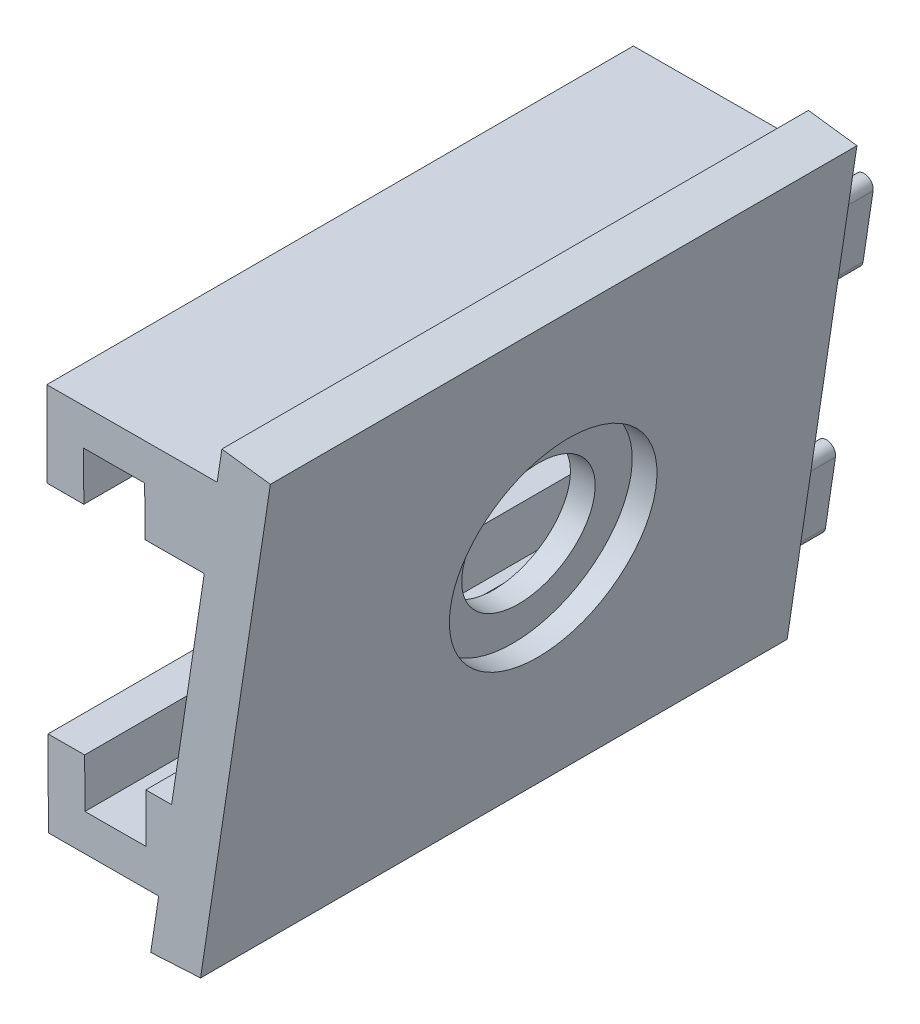
ISO-10303-21;
HEADER;
FILE_DESCRIPTION(('STEP AP214'),'2;1');
FILE_NAME('part.step','',(''),(''),'','','');
FILE_SCHEMA(('AUTOMOTIVE_DESIGN { 1 0 10303 214 1 1 1 1 }'));
ENDSEC;
DATA;
#1=APPLICATION_CONTEXT('core data for automotive mechanical design processes');
#2=APPLICATION_PROTOCOL_DEFINITION('international standard','automotive_design',2000,#1);
#3=PRODUCT_CONTEXT('',#1,'mechanical');
#4=PRODUCT('Part','Part','',(#3));
#5=PRODUCT_RELATED_PRODUCT_CATEGORY('part','',(#4));
#6=PRODUCT_DEFINITION_FORMATION('','',#4);
#7=PRODUCT_DEFINITION_CONTEXT('part definition',#1,'design');
#8=PRODUCT_DEFINITION('design','',#6,#7);
#9=PRODUCT_DEFINITION_SHAPE('','',#8);
#10=(LENGTH_UNIT() NAMED_UNIT(*) SI_UNIT(.MILLI.,.METRE.));
#11=(NAMED_UNIT(*) PLANE_ANGLE_UNIT() SI_UNIT($,.RADIAN.));
#12=(NAMED_UNIT(*) SI_UNIT($,.STERADIAN.) SOLID_ANGLE_UNIT());
#13=UNCERTAINTY_MEASURE_WITH_UNIT(LENGTH_MEASURE(1.E-05),#10,'distance_accuracy_value','');
#14=(GEOMETRIC_REPRESENTATION_CONTEXT(3) GLOBAL_UNCERTAINTY_ASSIGNED_CONTEXT((#13)) GLOBAL_UNIT_ASSIGNED_CONTEXT((#10,
#11,#12)) REPRESENTATION_CONTEXT('',''));
#15=CARTESIAN_POINT('',(0.,0.,0.));
#16=DIRECTION('',(0.,0.,1.));
#17=DIRECTION('',(1.,0.,0.));
#18=AXIS2_PLACEMENT_3D('',#15,#16,#17);
#19=CARTESIAN_POINT('',(0.,5.81427998343653,45.3507734760389));
#20=DIRECTION('',(0.,-1.,0.));
#21=DIRECTION('',(0.,0.,-1.));
#22=AXIS2_PLACEMENT_3D('',#19,#20,#21);
#23=PLANE('',#22);
#24=DIRECTION('',(1.,0.,0.));
#25=VECTOR('',#24,1.);
#26=CARTESIAN_POINT('',(-341.700745896123,5.81427998343653,3.4999999999995));
#27=LINE('',#26,#25);
#28=CARTESIAN_POINT('',(-341.700745896123,5.81427998343653,3.4999999999995));
#29=VERTEX_POINT('',#28);
#30=CARTESIAN_POINT('',(-339.200724888034,5.81427998343653,3.4999999999995));
#31=VERTEX_POINT('',#30);
#32=EDGE_CURVE('E291',#29,#31,#27,.T.);
#33=ORIENTED_EDGE('',*,*,#32,.F.);
#34=DIRECTION('',(0.,0.,1.));
#35=VECTOR('',#34,1.);
#36=CARTESIAN_POINT('',(-341.700745896123,5.81427998343653,3.4999999999995));
#37=LINE('',#36,#35);
#38=CARTESIAN_POINT('',(-341.700745896123,5.81427998343653,24.0000000000002));
#39=VERTEX_POINT('',#38);
#40=EDGE_CURVE('E278',#29,#39,#37,.T.);
#41=ORIENTED_EDGE('',*,*,#40,.T.);
#42=DIRECTION('',(1.,0.,0.));
#43=VECTOR('',#42,1.);
#44=CARTESIAN_POINT('',(0.,5.81427998343653,24.0000000000001));
#45=LINE('',#44,#43);
#46=CARTESIAN_POINT('',(-343.200758500977,5.81427998343653,23.9999999999999));
#47=VERTEX_POINT('',#46);
#48=EDGE_CURVE('E366',#47,#39,#45,.T.);
#49=ORIENTED_EDGE('',*,*,#48,.F.);
#50=DIRECTION('',(0.,0.,-1.));
#51=VECTOR('',#50,1.);
#52=CARTESIAN_POINT('',(-343.200758500977,5.81427998343653,45.3507734760389));
#53=LINE('',#52,#51);
#54=CARTESIAN_POINT('',(-343.200758500977,5.81427998343653,0.));
#55=VERTEX_POINT('',#54);
#56=EDGE_CURVE('E441',#47,#55,#53,.T.);
#57=ORIENTED_EDGE('',*,*,#56,.T.);
#58=DIRECTION('',(-1.,0.,0.));
#59=VECTOR('',#58,1.);
#60=CARTESIAN_POINT('',(0.,5.81427998343653,0.));
#61=LINE('',#60,#59);
#62=CARTESIAN_POINT('',(-339.200724888034,5.81427998343653,0.));
#63=VERTEX_POINT('',#62);
#64=EDGE_CURVE('E426',#63,#55,#61,.T.);
#65=ORIENTED_EDGE('',*,*,#64,.F.);
#66=DIRECTION('',(0.,0.,-1.));
#67=VECTOR('',#66,1.);
#68=CARTESIAN_POINT('',(-339.200724888034,5.81427998343653,45.3507734760389));
#69=LINE('',#68,#67);
#70=EDGE_CURVE('E436',#31,#63,#69,.T.);
#71=ORIENTED_EDGE('',*,*,#70,.F.);
#72=EDGE_LOOP('',(#33,#41,#49,#57,#65,#71));
#73=FACE_BOUND('',#72,.T.);
#74=ADVANCED_FACE('F46',(#73),#23,.T.);
#75=CARTESIAN_POINT('',(0.00674457212312909,-1.64518680264642,45.3507734760389));
#76=DIRECTION('',(-0.00409954385515742,0.999991596834783,0.));
#77=DIRECTION('',(-0.999991596834783,-0.00409954385515742,0.));
#78=AXIS2_PLACEMENT_3D('',#75,#76,#77);
#79=PLANE('',#78);
#80=DIRECTION('',(-0.999991596834783,-0.00409954385515742,0.));
#81=VECTOR('',#80,1.);
#82=CARTESIAN_POINT('',(-341.664422917003,-3.0458945081892,3.4999999999995));
#83=LINE('',#82,#81);
#84=CARTESIAN_POINT('',(-339.164443924916,-3.0356456485513,3.4999999999995));
#85=VERTEX_POINT('',#84);
#86=CARTESIAN_POINT('',(-341.664422917003,-3.0458945081892,3.4999999999995));
#87=VERTEX_POINT('',#86);
#88=EDGE_CURVE('E255',#85,#87,#83,.T.);
#89=ORIENTED_EDGE('',*,*,#88,.F.);
#90=DIRECTION('',(0.,0.,1.));
#91=VECTOR('',#90,1.);
#92=CARTESIAN_POINT('',(-339.164443924916,-3.0356456485513,3.4999999999995));
#93=LINE('',#92,#91);
#94=CARTESIAN_POINT('',(-339.164443924916,-3.0356456485513,24.0000000000002));
#95=VERTEX_POINT('',#94);
#96=EDGE_CURVE('E237',#85,#95,#93,.T.);
#97=ORIENTED_EDGE('',*,*,#96,.T.);
#98=DIRECTION('',(-0.999991596834783,-0.00409954385515742,0.));
#99=VECTOR('',#98,1.);
#100=CARTESIAN_POINT('',(0.00674457212314559,-1.64518680264642,24.0000000000002));
#101=LINE('',#100,#99);
#102=CARTESIAN_POINT('',(-338.108271990793,-3.03131578900427,23.9999999999999));
#103=VERTEX_POINT('',#102);
#104=EDGE_CURVE('E13',#103,#95,#101,.T.);
#105=ORIENTED_EDGE('',*,*,#104,.F.);
#106=DIRECTION('',(0.,0.,-1.));
#107=VECTOR('',#106,1.);
#108=CARTESIAN_POINT('',(-338.108271990793,-3.03131578900426,45.3507734760389));
#109=LINE('',#108,#107);
#110=CARTESIAN_POINT('',(-338.108271990793,-3.03131578900426,0.));
#111=VERTEX_POINT('',#110);
#112=EDGE_CURVE('E433',#103,#111,#109,.T.);
#113=ORIENTED_EDGE('',*,*,#112,.T.);
#114=DIRECTION('',(0.999991596834783,0.00409954385515742,0.));
#115=VECTOR('',#114,1.);
#116=CARTESIAN_POINT('',(0.00674457212312909,-1.64518680264642,0.));
#117=LINE('',#116,#115);
#118=CARTESIAN_POINT('',(-343.164410312255,-3.05204382397193,0.));
#119=VERTEX_POINT('',#118);
#120=EDGE_CURVE('E335',#119,#111,#117,.T.);
#121=ORIENTED_EDGE('',*,*,#120,.F.);
#122=DIRECTION('',(0.,0.,-1.));
#123=VECTOR('',#122,1.);
#124=CARTESIAN_POINT('',(-343.164410312255,-3.05204382397193,45.3507734760389));
#125=LINE('',#124,#123);
#126=CARTESIAN_POINT('',(-343.164410312255,-3.05204382397193,23.9999999999999));
#127=VERTEX_POINT('',#126);
#128=EDGE_CURVE('E462',#127,#119,#125,.T.);
#129=ORIENTED_EDGE('',*,*,#128,.F.);
#130=CARTESIAN_POINT('',(-341.664422917003,-3.0458945081892,24.0000000000002));
#131=VERTEX_POINT('',#130);
#132=EDGE_CURVE('E54',#131,#127,#101,.T.);
#133=ORIENTED_EDGE('',*,*,#132,.F.);
#134=DIRECTION('',(0.,0.,1.));
#135=VECTOR('',#134,1.);
#136=CARTESIAN_POINT('',(-341.664422917003,-3.0458945081892,3.4999999999995));
#137=LINE('',#136,#135);
#138=EDGE_CURVE('E248',#87,#131,#137,.T.);
#139=ORIENTED_EDGE('',*,*,#138,.F.);
#140=EDGE_LOOP('',(#89,#97,#105,#113,#121,#129,#133,#139));
#141=FACE_BOUND('',#140,.T.);
#142=ADVANCED_FACE('F48',(#141),#79,.T.);
#143=CARTESIAN_POINT('',(-318.478540608828,-5.34031448605415,23.9999999999999));
#144=DIRECTION('',(0.,0.,-1.));
#145=DIRECTION('',(-0.999991596834783,-0.00409954385515714,0.));
#146=AXIS2_PLACEMENT_3D('',#143,#144,#145);
#147=PLANE('',#146);
#148=DIRECTION('',(-0.00409954385519051,0.999991596834783,0.));
#149=VECTOR('',#148,1.);
#150=CARTESIAN_POINT('',(-339.164443924916,-3.0356456485513,24.0000000000002));
#151=LINE('',#150,#149);
#152=CARTESIAN_POINT('',(-339.156244837205,-5.03562884222087,24.0000000000002));
#153=VERTEX_POINT('',#152);
#154=EDGE_CURVE('E245',#153,#95,#151,.T.);
#155=ORIENTED_EDGE('',*,*,#154,.F.);
#156=DIRECTION('',(0.999991596834783,0.00409954385515733,0.));
#157=VECTOR('',#156,1.);
#158=CARTESIAN_POINT('',(-339.156244837205,-5.03562884222087,24.0000000000002));
#159=LINE('',#158,#157);
#160=CARTESIAN_POINT('',(-341.656223829292,-5.04587770185877,23.9999999999999));
#161=VERTEX_POINT('',#160);
#162=EDGE_CURVE('E258',#161,#153,#159,.T.);
#163=ORIENTED_EDGE('',*,*,#162,.F.);
#164=DIRECTION('',(0.00409954385516275,-0.999991596834783,0.));
#165=VECTOR('',#164,1.);
#166=CARTESIAN_POINT('',(-341.656223829292,-5.04587770185877,24.0000000000002));
#167=LINE('',#166,#165);
#168=EDGE_CURVE('E64',#131,#161,#167,.T.);
#169=ORIENTED_EDGE('',*,*,#168,.F.);
#170=ORIENTED_EDGE('',*,*,#132,.T.);
#171=DIRECTION('',(-0.00409954385513103,0.999991596834783,0.));
#172=VECTOR('',#171,1.);
#173=CARTESIAN_POINT('',(-343.171154884378,-1.40685702131648,23.9999999999999));
#174=LINE('',#173,#172);
#175=CARTESIAN_POINT('',(-343.150061908762,-6.55201441289368,23.9999999999999));
#176=VERTEX_POINT('',#175);
#177=EDGE_CURVE('E392',#176,#127,#174,.T.);
#178=ORIENTED_EDGE('',*,*,#177,.F.);
#179=DIRECTION('',(-0.999991596834783,-0.00409954385515742,0.));
#180=VECTOR('',#179,1.);
#181=CARTESIAN_POINT('',(0.0210929756161966,-5.14515739156816,24.0000000000002));
#182=LINE('',#181,#180);
#183=CARTESIAN_POINT('',(-338.636620437346,-6.53351120615842,23.9999999999999));
#184=VERTEX_POINT('',#183);
#185=EDGE_CURVE('E393',#184,#176,#182,.T.);
#186=ORIENTED_EDGE('',*,*,#185,.F.);
#187=DIRECTION('',(0.149174065976889,0.988810951618115,0.));
#188=VECTOR('',#187,1.);
#189=CARTESIAN_POINT('',(-330.137247677989,49.8051882272888,23.9999999999998));
#190=LINE('',#189,#188);
#191=CARTESIAN_POINT('',(-338.96258407531,-8.69418446351695,23.9999999999999));
#192=VERTEX_POINT('',#191);
#193=EDGE_CURVE('E389',#192,#184,#190,.T.);
#194=ORIENTED_EDGE('',*,*,#193,.F.);
#195=DIRECTION('',(-0.998447894816996,-0.0556938177494606,0.));
#196=VECTOR('',#195,1.);
#197=CARTESIAN_POINT('',(-0.567933819440734,10.1816027223503,24.0000000000001));
#198=LINE('',#197,#196);
#199=CARTESIAN_POINT('',(-336.922787570696,-8.58040380919974,23.9999999999999));
#200=VERTEX_POINT('',#199);
#201=EDGE_CURVE('E383',#200,#192,#198,.T.);
#202=ORIENTED_EDGE('',*,*,#201,.F.);
#203=DIRECTION('',(-0.149174065976872,-0.988810951618118,0.));
#204=VECTOR('',#203,1.);
#205=CARTESIAN_POINT('',(-328.159625774754,49.5068400953297,23.9999999999998));
#206=LINE('',#205,#204);
#207=CARTESIAN_POINT('',(-334.068528093803,10.3392590090674,23.9999999999999));
#208=VERTEX_POINT('',#207);
#209=EDGE_CURVE('E385',#208,#200,#206,.T.);
#210=ORIENTED_EDGE('',*,*,#209,.F.);
#211=DIRECTION('',(0.991585348350997,-0.129454613419654,0.));
#212=VECTOR('',#211,1.);
#213=CARTESIAN_POINT('',(-4.27128434113844,-32.7168175736171,24.0000000000002));
#214=LINE('',#213,#212);
#215=CARTESIAN_POINT('',(-336.052092085708,10.5982195818434,23.9999999999999));
#216=VERTEX_POINT('',#215);
#217=EDGE_CURVE('E378',#216,#208,#214,.T.);
#218=ORIENTED_EDGE('',*,*,#217,.F.);
#219=DIRECTION('',(0.149174065974806,0.98881095161843,0.));
#220=VECTOR('',#219,1.);
#221=CARTESIAN_POINT('',(-330.137247678177,49.8051882266057,23.9999999999998));
#222=LINE('',#221,#220);
#223=CARTESIAN_POINT('',(-336.243956757952,9.32643089723972,23.9999999999999));
#224=VERTEX_POINT('',#223);
#225=EDGE_CURVE('E379',#224,#216,#222,.T.);
#226=ORIENTED_EDGE('',*,*,#225,.F.);
#227=DIRECTION('',(-0.999991596834783,-0.00409954385515728,0.));
#228=VECTOR('',#227,1.);
#229=CARTESIAN_POINT('',(-0.0438847944880469,10.7047094182631,24.0000000000001));
#230=LINE('',#229,#228);
#231=CARTESIAN_POINT('',(-343.215039678866,9.29785239693763,23.9999999999999));
#232=VERTEX_POINT('',#231);
#233=EDGE_CURVE('E372',#224,#232,#230,.T.);
#234=ORIENTED_EDGE('',*,*,#233,.T.);
#235=DIRECTION('',(0.00409954385517723,-0.999991596834783,0.));
#236=VECTOR('',#235,1.);
#237=CARTESIAN_POINT('',(-343.171154884378,-1.40685702133233,23.9999999999999));
#238=LINE('',#237,#236);
#239=EDGE_CURVE('E375',#232,#47,#238,.T.);
#240=ORIENTED_EDGE('',*,*,#239,.T.);
#241=ORIENTED_EDGE('',*,*,#48,.T.);
#242=DIRECTION('',(0.00409954385518906,-0.999991596834783,0.));
#243=VECTOR('',#242,1.);
#244=CARTESIAN_POINT('',(-341.708902967831,7.8040143174682,24.0000000000002));
#245=LINE('',#244,#243);
#246=CARTESIAN_POINT('',(-341.708902967831,7.8040143174682,24.0000000000002));
#247=VERTEX_POINT('',#246);
#248=EDGE_CURVE('E287',#247,#39,#245,.T.);
#249=ORIENTED_EDGE('',*,*,#248,.F.);
#250=DIRECTION('',(-0.999991596834783,-0.00409954385515708,0.));
#251=VECTOR('',#250,1.);
#252=CARTESIAN_POINT('',(-339.208923975744,7.81426317710609,24.0000000000002));
#253=LINE('',#252,#251);
#254=CARTESIAN_POINT('',(-339.208923975744,7.81426317710609,23.9999999999999));
#255=VERTEX_POINT('',#254);
#256=EDGE_CURVE('E266',#255,#247,#253,.T.);
#257=ORIENTED_EDGE('',*,*,#256,.F.);
#258=DIRECTION('',(-0.00409954385516276,0.999991596834783,0.));
#259=VECTOR('',#258,1.);
#260=CARTESIAN_POINT('',(-339.200724888034,5.81427998343653,24.0000000000002));
#261=LINE('',#260,#259);
#262=CARTESIAN_POINT('',(-339.200724888034,5.81427998343653,24.0000000000002));
#263=VERTEX_POINT('',#262);
#264=EDGE_CURVE('E73',#263,#255,#261,.T.);
#265=ORIENTED_EDGE('',*,*,#264,.F.);
#266=DIRECTION('',(0.999991596834783,0.00409954385515626,0.));
#267=VECTOR('',#266,1.);
#268=CARTESIAN_POINT('',(-0.0295363909949876,7.20473882934102,24.0000000000001));
#269=LINE('',#268,#267);
#270=CARTESIAN_POINT('',(-336.772305204508,5.82423548008555,23.9999999999999));
#271=VERTEX_POINT('',#270);
#272=EDGE_CURVE('E368',#263,#271,#269,.T.);
#273=ORIENTED_EDGE('',*,*,#272,.T.);
#274=DIRECTION('',(0.149174065976879,0.988810951618117,0.));
#275=VECTOR('',#274,1.);
#276=CARTESIAN_POINT('',(-330.13724767799,49.8051882272856,23.9999999999998));
#277=LINE('',#276,#275);
#278=EDGE_CURVE('E367',#103,#271,#277,.T.);
#279=ORIENTED_EDGE('',*,*,#278,.F.);
#280=ORIENTED_EDGE('',*,*,#104,.T.);
#281=EDGE_LOOP('',(#155,#163,#169,#170,#178,#186,#194,#202,#210,#218,#226,#234,#240,#241,#249,
#257,#265,#273,#279,#280));
#282=FACE_BOUND('',#281,.T.);
#283=ADVANCED_FACE('F487',(#282),#147,.F.);
#284=CARTESIAN_POINT('',(0.,0.,0.));
#285=DIRECTION('',(0.,0.,1.));
#286=DIRECTION('',(1.,0.,0.));
#287=AXIS2_PLACEMENT_3D('',#284,#285,#286);
#288=PLANE('',#287);
#289=CARTESIAN_POINT('',(-337.066288185389,-2.82802979560191,0.));
#290=DIRECTION('',(0.,0.,-1.));
#291=DIRECTION('',(0.,1.,0.));
#292=AXIS2_PLACEMENT_3D('',#289,#290,#291);
#293=CIRCLE('',#292,0.37500000000001);
#294=CARTESIAN_POINT('',(-337.437092292243,-2.77208952086043,0.));
#295=VERTEX_POINT('',#294);
#296=CARTESIAN_POINT('',(-336.695484078529,-2.88397007034309,0.));
#297=VERTEX_POINT('',#296);
#298=EDGE_CURVE('E313',#295,#297,#293,.T.);
#299=ORIENTED_EDGE('',*,*,#298,.F.);
#300=DIRECTION('',(0.149174065976839,0.988810951618123,0.));
#301=VECTOR('',#300,1.);
#302=CARTESIAN_POINT('',(-337.437092292243,-2.77208952086043,0.));
#303=LINE('',#302,#301);
#304=CARTESIAN_POINT('',(-337.847320973679,-5.49131963781027,0.));
#305=VERTEX_POINT('',#304);
#306=EDGE_CURVE('E350',#305,#295,#303,.T.);
#307=ORIENTED_EDGE('',*,*,#306,.F.);
#308=CARTESIAN_POINT('',(-337.476516866825,-5.54725991255174,0.));
#309=DIRECTION('',(0.,0.,-1.));
#310=DIRECTION('',(0.,1.,0.));
#311=AXIS2_PLACEMENT_3D('',#308,#309,#310);
#312=CIRCLE('',#311,0.374999999999925);
#313=CARTESIAN_POINT('',(-337.105712759969,-5.60320018729248,0.));
#314=VERTEX_POINT('',#313);
#315=EDGE_CURVE('E349',#314,#305,#312,.T.);
#316=ORIENTED_EDGE('',*,*,#315,.F.);
#317=DIRECTION('',(-0.1491740659769,-0.988810951618114,0.));
#318=VECTOR('',#317,1.);
#319=CARTESIAN_POINT('',(-336.695484078529,-2.88397007034309,0.));
#320=LINE('',#319,#318);
#321=EDGE_CURVE('E353',#297,#314,#320,.T.);
#322=ORIENTED_EDGE('',*,*,#321,.F.);
#323=EDGE_LOOP('',(#299,#307,#316,#322));
#324=FACE_BOUND('',#323,.T.);
#325=ORIENTED_EDGE('',*,*,#120,.T.);
#326=DIRECTION('',(-0.149174065976879,-0.988810951618117,0.));
#327=VECTOR('',#326,1.);
#328=CARTESIAN_POINT('',(-330.13724767799,49.8051882272856,0.));
#329=LINE('',#328,#327);
#330=CARTESIAN_POINT('',(-336.772305204508,5.82423548008555,0.));
#331=VERTEX_POINT('',#330);
#332=EDGE_CURVE('E435',#331,#111,#329,.T.);
#333=ORIENTED_EDGE('',*,*,#332,.F.);
#334=DIRECTION('',(-0.999991596834783,-0.00409954385515626,0.));
#335=VECTOR('',#334,1.);
#336=CARTESIAN_POINT('',(-0.0295363909950041,7.20473882934102,0.));
#337=LINE('',#336,#335);
#338=EDGE_CURVE('E428',#331,#63,#337,.T.);
#339=ORIENTED_EDGE('',*,*,#338,.T.);
#340=ORIENTED_EDGE('',*,*,#64,.T.);
#341=DIRECTION('',(-0.00409954385517723,0.999991596834783,0.));
#342=VECTOR('',#341,1.);
#343=CARTESIAN_POINT('',(-343.171154884378,-1.40685702133231,0.));
#344=LINE('',#343,#342);
#345=CARTESIAN_POINT('',(-343.215039678866,9.29785239693763,0.));
#346=VERTEX_POINT('',#345);
#347=EDGE_CURVE('E423',#55,#346,#344,.T.);
#348=ORIENTED_EDGE('',*,*,#347,.T.);
#349=DIRECTION('',(0.999991596834783,0.00409954385515728,0.));
#350=VECTOR('',#349,1.);
#351=CARTESIAN_POINT('',(-0.0438847944880634,10.7047094182631,0.));
#352=LINE('',#351,#350);
#353=CARTESIAN_POINT('',(-336.243956757952,9.32643089723972,0.));
#354=VERTEX_POINT('',#353);
#355=EDGE_CURVE('E419',#346,#354,#352,.T.);
#356=ORIENTED_EDGE('',*,*,#355,.T.);
#357=DIRECTION('',(-0.149174065974806,-0.98881095161843,0.));
#358=VECTOR('',#357,1.);
#359=CARTESIAN_POINT('',(-330.137247678177,49.8051882266058,0.));
#360=LINE('',#359,#358);
#361=CARTESIAN_POINT('',(-336.052092085708,10.5982195818434,0.));
#362=VERTEX_POINT('',#361);
#363=EDGE_CURVE('E420',#362,#354,#360,.T.);
#364=ORIENTED_EDGE('',*,*,#363,.F.);
#365=DIRECTION('',(-0.991585348350997,0.129454613419654,0.));
#366=VECTOR('',#365,1.);
#367=CARTESIAN_POINT('',(-4.27128434113846,-32.7168175736171,0.));
#368=LINE('',#367,#366);
#369=CARTESIAN_POINT('',(-334.068528093803,10.3392590090674,0.));
#370=VERTEX_POINT('',#369);
#371=EDGE_CURVE('E414',#370,#362,#368,.T.);
#372=ORIENTED_EDGE('',*,*,#371,.F.);
#373=DIRECTION('',(0.149174065976872,0.988810951618118,0.));
#374=VECTOR('',#373,1.);
#375=CARTESIAN_POINT('',(-328.159625774754,49.5068400953297,0.));
#376=LINE('',#375,#374);
#377=CARTESIAN_POINT('',(-336.922787570697,-8.58040380919974,0.));
#378=VERTEX_POINT('',#377);
#379=EDGE_CURVE('E413',#378,#370,#376,.T.);
#380=ORIENTED_EDGE('',*,*,#379,.F.);
#381=DIRECTION('',(0.998447894816995,0.0556938177494606,0.));
#382=VECTOR('',#381,1.);
#383=CARTESIAN_POINT('',(-0.567933819440749,10.1816027223503,0.));
#384=LINE('',#383,#382);
#385=CARTESIAN_POINT('',(-338.96258407531,-8.69418446351695,0.));
#386=VERTEX_POINT('',#385);
#387=EDGE_CURVE('E406',#386,#378,#384,.T.);
#388=ORIENTED_EDGE('',*,*,#387,.F.);
#389=DIRECTION('',(-0.149174065976889,-0.988810951618115,0.));
#390=VECTOR('',#389,1.);
#391=CARTESIAN_POINT('',(-330.137247677989,49.8051882272888,0.));
#392=LINE('',#391,#390);
#393=CARTESIAN_POINT('',(-338.636620437346,-6.53351120615842,0.));
#394=VERTEX_POINT('',#393);
#395=EDGE_CURVE('E402',#394,#386,#392,.T.);
#396=ORIENTED_EDGE('',*,*,#395,.F.);
#397=DIRECTION('',(0.999991596834783,0.00409954385515742,0.));
#398=VECTOR('',#397,1.);
#399=CARTESIAN_POINT('',(0.0210929756161801,-5.14515739156816,0.));
#400=LINE('',#399,#398);
#401=CARTESIAN_POINT('',(-343.150061908762,-6.55201441289368,0.));
#402=VERTEX_POINT('',#401);
#403=EDGE_CURVE('E401',#402,#394,#400,.T.);
#404=ORIENTED_EDGE('',*,*,#403,.F.);
#405=DIRECTION('',(0.00409954385513103,-0.999991596834783,0.));
#406=VECTOR('',#405,1.);
#407=CARTESIAN_POINT('',(-343.171154884378,-1.40685702131646,0.));
#408=LINE('',#407,#406);
#409=EDGE_CURVE('E397',#119,#402,#408,.T.);
#410=ORIENTED_EDGE('',*,*,#409,.F.);
#411=EDGE_LOOP('',(#325,#333,#339,#340,#348,#356,#364,#372,#380,#388,#396,#404,#410));
#412=FACE_BOUND('',#411,.T.);
#413=CARTESIAN_POINT('',(-335.526571494866,7.37809226729448,0.));
#414=DIRECTION('',(0.,0.,-1.));
#415=DIRECTION('',(0.,1.,0.));
#416=AXIS2_PLACEMENT_3D('',#413,#414,#415);
#417=CIRCLE('',#416,0.374999999999953);
#418=CARTESIAN_POINT('',(-335.89737560172,7.43403254203594,0.));
#419=VERTEX_POINT('',#418);
#420=CARTESIAN_POINT('',(-335.155767388006,7.3221519925533,0.));
#421=VERTEX_POINT('',#420);
#422=EDGE_CURVE('E312',#419,#421,#417,.T.);
#423=ORIENTED_EDGE('',*,*,#422,.F.);
#424=DIRECTION('',(0.14917406597692,0.988810951618111,0.));
#425=VECTOR('',#424,1.);
#426=CARTESIAN_POINT('',(-335.89737560172,7.43403254203594,0.));
#427=LINE('',#426,#425);
#428=CARTESIAN_POINT('',(-336.307604283156,4.71480242508613,0.));
#429=VERTEX_POINT('',#428);
#430=EDGE_CURVE('E303',#429,#419,#427,.T.);
#431=ORIENTED_EDGE('',*,*,#430,.F.);
#432=CARTESIAN_POINT('',(-335.936800176302,4.65886215034466,0.));
#433=DIRECTION('',(0.,0.,-1.));
#434=DIRECTION('',(0.,1.,0.));
#435=AXIS2_PLACEMENT_3D('',#432,#433,#434);
#436=CIRCLE('',#435,0.375000000000094);
#437=CARTESIAN_POINT('',(-335.565996069445,4.60292187560387,0.));
#438=VERTEX_POINT('',#437);
#439=EDGE_CURVE('E316',#438,#429,#436,.T.);
#440=ORIENTED_EDGE('',*,*,#439,.F.);
#441=DIRECTION('',(-0.149174065976819,-0.988810951618126,0.));
#442=VECTOR('',#441,1.);
#443=CARTESIAN_POINT('',(-335.155767388006,7.3221519925533,0.));
#444=LINE('',#443,#442);
#445=EDGE_CURVE('E311',#421,#438,#444,.T.);
#446=ORIENTED_EDGE('',*,*,#445,.F.);
#447=EDGE_LOOP('',(#423,#431,#440,#446));
#448=FACE_BOUND('',#447,.T.);
#449=ADVANCED_FACE('F481',(#324,#412,#448),#288,.F.);
#450=CARTESIAN_POINT('',(-330.13724767799,49.8051882272856,45.3507734760389));
#451=DIRECTION('',(0.988810951618117,-0.149174065976879,0.));
#452=DIRECTION('',(0.149174065976879,0.988810951618117,0.));
#453=AXIS2_PLACEMENT_3D('',#450,#451,#452);
#454=PLANE('',#453);
#455=CARTESIAN_POINT('',(-337.519540864633,0.871130532968574,10.9999999999995));
#456=DIRECTION('',(0.988810951618117,-0.149174065976879,0.));
#457=DIRECTION('',(0.149174065976879,0.988810951618117,0.));
#458=AXIS2_PLACEMENT_3D('',#455,#456,#457);
#459=ELLIPSE('',#458,2.73226505339358,2.70000000000011);
#460=CARTESIAN_POINT('',(-337.111957777292,3.5728241404876,10.9999999999995));
#461=VERTEX_POINT('',#460);
#462=EDGE_CURVE('E281',#461,#461,#459,.F.);
#463=ORIENTED_EDGE('',*,*,#462,.F.);
#464=EDGE_LOOP('',(#463));
#465=FACE_BOUND('',#464,.T.);
#466=ORIENTED_EDGE('',*,*,#112,.F.);
#467=ORIENTED_EDGE('',*,*,#278,.T.);
#468=DIRECTION('',(0.,0.,-1.));
#469=VECTOR('',#468,1.);
#470=CARTESIAN_POINT('',(-336.772305204508,5.82423548008555,45.3507734760389));
#471=LINE('',#470,#469);
#472=EDGE_CURVE('E440',#271,#331,#471,.T.);
#473=ORIENTED_EDGE('',*,*,#472,.T.);
#474=ORIENTED_EDGE('',*,*,#332,.T.);
#475=EDGE_LOOP('',(#466,#467,#473,#474));
#476=FACE_BOUND('',#475,.T.);
#477=ADVANCED_FACE('F478',(#465,#476),#454,.F.);
#478=CARTESIAN_POINT('',(-0.0295363909950041,7.20473882934102,45.3507734760389));
#479=DIRECTION('',(0.00409954385515626,-0.999991596834783,0.));
#480=DIRECTION('',(0.999991596834783,0.00409954385515626,0.));
#481=AXIS2_PLACEMENT_3D('',#478,#479,#480);
#482=PLANE('',#481);
#483=ORIENTED_EDGE('',*,*,#272,.F.);
#484=EDGE_CURVE('E438',#263,#31,#69,.T.);
#485=ORIENTED_EDGE('',*,*,#484,.T.);
#486=ORIENTED_EDGE('',*,*,#70,.T.);
#487=ORIENTED_EDGE('',*,*,#338,.F.);
#488=ORIENTED_EDGE('',*,*,#472,.F.);
#489=EDGE_LOOP('',(#483,#485,#486,#487,#488));
#490=FACE_BOUND('',#489,.T.);
#491=ADVANCED_FACE('F482',(#490),#482,.T.);
#492=CARTESIAN_POINT('',(-343.171154884378,-1.40685702133231,45.3507734760389));
#493=DIRECTION('',(-0.999991596834783,-0.00409954385517723,0.));
#494=DIRECTION('',(0.00409954385517723,-0.999991596834783,0.));
#495=AXIS2_PLACEMENT_3D('',#492,#493,#494);
#496=PLANE('',#495);
#497=ORIENTED_EDGE('',*,*,#239,.F.);
#498=DIRECTION('',(0.,0.,-1.));
#499=VECTOR('',#498,1.);
#500=CARTESIAN_POINT('',(-343.215039678866,9.29785239693763,45.3507734760389));
#501=LINE('',#500,#499);
#502=EDGE_CURVE('E444',#232,#346,#501,.T.);
#503=ORIENTED_EDGE('',*,*,#502,.T.);
#504=ORIENTED_EDGE('',*,*,#347,.F.);
#505=ORIENTED_EDGE('',*,*,#56,.F.);
#506=EDGE_LOOP('',(#497,#503,#504,#505));
#507=FACE_BOUND('',#506,.T.);
#508=ADVANCED_FACE('F526',(#507),#496,.T.);
#509=CARTESIAN_POINT('',(-0.0438847944880634,10.7047094182631,45.3507734760389));
#510=DIRECTION('',(-0.00409954385515728,0.999991596834783,0.));
#511=DIRECTION('',(-0.999991596834783,-0.00409954385515728,0.));
#512=AXIS2_PLACEMENT_3D('',#509,#510,#511);
#513=PLANE('',#512);
#514=ORIENTED_EDGE('',*,*,#233,.F.);
#515=DIRECTION('',(0.,0.,-1.));
#516=VECTOR('',#515,1.);
#517=CARTESIAN_POINT('',(-336.243956757952,9.32643089723972,45.3507734760389));
#518=LINE('',#517,#516);
#519=EDGE_CURVE('E450',#224,#354,#518,.T.);
#520=ORIENTED_EDGE('',*,*,#519,.T.);
#521=ORIENTED_EDGE('',*,*,#355,.F.);
#522=ORIENTED_EDGE('',*,*,#502,.F.);
#523=EDGE_LOOP('',(#514,#520,#521,#522));
#524=FACE_BOUND('',#523,.T.);
#525=ADVANCED_FACE('F527',(#524),#513,.T.);
#526=CARTESIAN_POINT('',(-330.137247678177,49.8051882266058,45.3507734760389));
#527=DIRECTION('',(0.98881095161843,-0.149174065974806,0.));
#528=DIRECTION('',(0.149174065974806,0.98881095161843,0.));
#529=AXIS2_PLACEMENT_3D('',#526,#527,#528);
#530=PLANE('',#529);
#531=ORIENTED_EDGE('',*,*,#519,.F.);
#532=ORIENTED_EDGE('',*,*,#225,.T.);
#533=DIRECTION('',(0.,0.,-1.));
#534=VECTOR('',#533,1.);
#535=CARTESIAN_POINT('',(-336.052092085708,10.5982195818434,45.3507734760389));
#536=LINE('',#535,#534);
#537=EDGE_CURVE('E447',#216,#362,#536,.T.);
#538=ORIENTED_EDGE('',*,*,#537,.T.);
#539=ORIENTED_EDGE('',*,*,#363,.T.);
#540=EDGE_LOOP('',(#531,#532,#538,#539));
#541=FACE_BOUND('',#540,.T.);
#542=ADVANCED_FACE('F534',(#541),#530,.F.);
#543=CARTESIAN_POINT('',(-4.27128434113846,-32.7168175736171,45.3507734760389));
#544=DIRECTION('',(-0.129454613419654,-0.991585348350997,0.));
#545=DIRECTION('',(0.991585348350997,-0.129454613419654,0.));
#546=AXIS2_PLACEMENT_3D('',#543,#544,#545);
#547=PLANE('',#546);
#548=ORIENTED_EDGE('',*,*,#537,.F.);
#549=ORIENTED_EDGE('',*,*,#217,.T.);
#550=DIRECTION('',(0.,0.,-1.));
#551=VECTOR('',#550,1.);
#552=CARTESIAN_POINT('',(-334.068528093803,10.3392590090674,45.3507734760389));
#553=LINE('',#552,#551);
#554=EDGE_CURVE('E454',#208,#370,#553,.T.);
#555=ORIENTED_EDGE('',*,*,#554,.T.);
#556=ORIENTED_EDGE('',*,*,#371,.T.);
#557=EDGE_LOOP('',(#548,#549,#555,#556));
#558=FACE_BOUND('',#557,.T.);
#559=ADVANCED_FACE('F539',(#558),#547,.F.);
#560=CARTESIAN_POINT('',(-328.159625774754,49.5068400953297,45.3507734760389));
#561=DIRECTION('',(-0.988810951618118,0.149174065976872,0.));
#562=DIRECTION('',(-0.149174065976872,-0.988810951618118,0.));
#563=AXIS2_PLACEMENT_3D('',#560,#561,#562);
#564=PLANE('',#563);
#565=CARTESIAN_POINT('',(-335.495657832249,0.879427599939168,10.9999999999995));
#566=DIRECTION('',(-0.988810951618118,0.149174065976872,0.));
#567=DIRECTION('',(0.149174065976872,0.988810951618118,0.));
#568=AXIS2_PLACEMENT_3D('',#565,#566,#567);
#569=ELLIPSE('',#568,4.25019008305661,4.2000000000001);
#570=CARTESIAN_POINT('',(-334.861639696385,5.08206210052426,10.9999999999995));
#571=VERTEX_POINT('',#570);
#572=EDGE_CURVE('E49',#571,#571,#569,.F.);
#573=ORIENTED_EDGE('',*,*,#572,.F.);
#574=EDGE_LOOP('',(#573));
#575=FACE_BOUND('',#574,.T.);
#576=ORIENTED_EDGE('',*,*,#554,.F.);
#577=ORIENTED_EDGE('',*,*,#209,.T.);
#578=DIRECTION('',(0.,0.,-1.));
#579=VECTOR('',#578,1.);
#580=CARTESIAN_POINT('',(-336.922787570697,-8.58040380919974,45.3507734760389));
#581=LINE('',#580,#579);
#582=EDGE_CURVE('E455',#200,#378,#581,.T.);
#583=ORIENTED_EDGE('',*,*,#582,.T.);
#584=ORIENTED_EDGE('',*,*,#379,.T.);
#585=EDGE_LOOP('',(#576,#577,#583,#584));
#586=FACE_BOUND('',#585,.T.);
#587=ADVANCED_FACE('F545',(#575,#586),#564,.F.);
#588=CARTESIAN_POINT('',(-0.567933819440749,10.1816027223503,45.3507734760389));
#589=DIRECTION('',(-0.0556938177494606,0.998447894816995,0.));
#590=DIRECTION('',(-0.998447894816995,-0.0556938177494606,0.));
#591=AXIS2_PLACEMENT_3D('',#588,#589,#590);
#592=PLANE('',#591);
#593=ORIENTED_EDGE('',*,*,#582,.F.);
#594=ORIENTED_EDGE('',*,*,#201,.T.);
#595=DIRECTION('',(0.,0.,-1.));
#596=VECTOR('',#595,1.);
#597=CARTESIAN_POINT('',(-338.96258407531,-8.69418446351695,45.3507734760389));
#598=LINE('',#597,#596);
#599=EDGE_CURVE('E452',#192,#386,#598,.T.);
#600=ORIENTED_EDGE('',*,*,#599,.T.);
#601=ORIENTED_EDGE('',*,*,#387,.T.);
#602=EDGE_LOOP('',(#593,#594,#600,#601));
#603=FACE_BOUND('',#602,.T.);
#604=ADVANCED_FACE('F548',(#603),#592,.F.);
#605=CARTESIAN_POINT('',(-330.137247677989,49.8051882272888,45.3507734760389));
#606=DIRECTION('',(0.988810951618115,-0.149174065976889,0.));
#607=DIRECTION('',(0.149174065976889,0.988810951618115,0.));
#608=AXIS2_PLACEMENT_3D('',#605,#606,#607);
#609=PLANE('',#608);
#610=ORIENTED_EDGE('',*,*,#599,.F.);
#611=ORIENTED_EDGE('',*,*,#193,.T.);
#612=DIRECTION('',(0.,0.,-1.));
#613=VECTOR('',#612,1.);
#614=CARTESIAN_POINT('',(-338.636620437346,-6.53351120615842,45.3507734760389));
#615=LINE('',#614,#613);
#616=EDGE_CURVE('E460',#184,#394,#615,.T.);
#617=ORIENTED_EDGE('',*,*,#616,.T.);
#618=ORIENTED_EDGE('',*,*,#395,.T.);
#619=EDGE_LOOP('',(#610,#611,#617,#618));
#620=FACE_BOUND('',#619,.T.);
#621=ADVANCED_FACE('F549',(#620),#609,.F.);
#622=CARTESIAN_POINT('',(0.0210929756161801,-5.14515739156816,45.3507734760389));
#623=DIRECTION('',(-0.00409954385515742,0.999991596834783,0.));
#624=DIRECTION('',(-0.999991596834783,-0.00409954385515742,0.));
#625=AXIS2_PLACEMENT_3D('',#622,#623,#624);
#626=PLANE('',#625);
#627=ORIENTED_EDGE('',*,*,#616,.F.);
#628=ORIENTED_EDGE('',*,*,#185,.T.);
#629=DIRECTION('',(0.,0.,-1.));
#630=VECTOR('',#629,1.);
#631=CARTESIAN_POINT('',(-343.150061908762,-6.55201441289368,45.3507734760389));
#632=LINE('',#631,#630);
#633=EDGE_CURVE('E459',#176,#402,#632,.T.);
#634=ORIENTED_EDGE('',*,*,#633,.T.);
#635=ORIENTED_EDGE('',*,*,#403,.T.);
#636=EDGE_LOOP('',(#627,#628,#634,#635));
#637=FACE_BOUND('',#636,.T.);
#638=ADVANCED_FACE('F553',(#637),#626,.F.);
#639=CARTESIAN_POINT('',(-343.171154884378,-1.40685702131646,45.3507734760389));
#640=DIRECTION('',(0.999991596834783,0.00409954385513103,0.));
#641=DIRECTION('',(-0.00409954385513103,0.999991596834783,0.));
#642=AXIS2_PLACEMENT_3D('',#639,#640,#641);
#643=PLANE('',#642);
#644=ORIENTED_EDGE('',*,*,#633,.F.);
#645=ORIENTED_EDGE('',*,*,#177,.T.);
#646=ORIENTED_EDGE('',*,*,#128,.T.);
#647=ORIENTED_EDGE('',*,*,#409,.T.);
#648=EDGE_LOOP('',(#644,#645,#646,#647));
#649=FACE_BOUND('',#648,.T.);
#650=ADVANCED_FACE('F503',(#649),#643,.F.);
#651=CARTESIAN_POINT('',(-337.066288185389,-2.82802979560191,-1.75));
#652=DIRECTION('',(0.,0.,1.));
#653=DIRECTION('',(0.,-1.,0.));
#654=AXIS2_PLACEMENT_3D('',#651,#652,#653);
#655=CYLINDRICAL_SURFACE('',#654,0.37500000000001);
#656=ORIENTED_EDGE('',*,*,#298,.T.);
#657=DIRECTION('',(0.,0.,1.));
#658=VECTOR('',#657,1.);
#659=CARTESIAN_POINT('',(-336.695484078529,-2.88397007034309,-1.75));
#660=LINE('',#659,#658);
#661=CARTESIAN_POINT('',(-336.695484078529,-2.88397007034309,-1.75));
#662=VERTEX_POINT('',#661);
#663=EDGE_CURVE('E275',#662,#297,#660,.T.);
#664=ORIENTED_EDGE('',*,*,#663,.F.);
#665=CARTESIAN_POINT('',(-337.066288185389,-2.82802979560191,-1.75));
#666=DIRECTION('',(0.,0.,-1.));
#667=DIRECTION('',(0.,1.,0.));
#668=AXIS2_PLACEMENT_3D('',#665,#666,#667);
#669=CIRCLE('',#668,0.37500000000001);
#670=CARTESIAN_POINT('',(-337.437092292243,-2.77208952086043,-1.75));
#671=VERTEX_POINT('',#670);
#672=EDGE_CURVE('E351',#671,#662,#669,.T.);
#673=ORIENTED_EDGE('',*,*,#672,.F.);
#674=DIRECTION('',(0.,0.,1.));
#675=VECTOR('',#674,1.);
#676=CARTESIAN_POINT('',(-337.437092292243,-2.77208952086043,-1.75));
#677=LINE('',#676,#675);
#678=EDGE_CURVE('E343',#671,#295,#677,.T.);
#679=ORIENTED_EDGE('',*,*,#678,.T.);
#680=EDGE_LOOP('',(#656,#664,#673,#679));
#681=FACE_BOUND('',#680,.T.);
#682=ADVANCED_FACE('F560',(#681),#655,.T.);
#683=CARTESIAN_POINT('',(-336.695484078529,-2.88397007034309,-1.75));
#684=DIRECTION('',(-0.988810951618114,0.1491740659769,0.));
#685=DIRECTION('',(-0.1491740659769,-0.988810951618114,0.));
#686=AXIS2_PLACEMENT_3D('',#683,#684,#685);
#687=PLANE('',#686);
#688=ORIENTED_EDGE('',*,*,#321,.T.);
#689=DIRECTION('',(0.,0.,1.));
#690=VECTOR('',#689,1.);
#691=CARTESIAN_POINT('',(-337.105712759969,-5.60320018729248,-1.75));
#692=LINE('',#691,#690);
#693=CARTESIAN_POINT('',(-337.105712759969,-5.60320018729248,-1.75));
#694=VERTEX_POINT('',#693);
#695=EDGE_CURVE('E340',#694,#314,#692,.T.);
#696=ORIENTED_EDGE('',*,*,#695,.F.);
#697=DIRECTION('',(-0.1491740659769,-0.988810951618114,0.));
#698=VECTOR('',#697,1.);
#699=CARTESIAN_POINT('',(-336.695484078529,-2.88397007034309,-1.75));
#700=LINE('',#699,#698);
#701=EDGE_CURVE('E365',#662,#694,#700,.T.);
#702=ORIENTED_EDGE('',*,*,#701,.F.);
#703=ORIENTED_EDGE('',*,*,#663,.T.);
#704=EDGE_LOOP('',(#688,#696,#702,#703));
#705=FACE_BOUND('',#704,.T.);
#706=ADVANCED_FACE('F564',(#705),#687,.F.);
#707=CARTESIAN_POINT('',(-337.476516866825,-5.54725991255174,-1.75));
#708=DIRECTION('',(0.,0.,1.));
#709=DIRECTION('',(0.,-1.,0.));
#710=AXIS2_PLACEMENT_3D('',#707,#708,#709);
#711=CYLINDRICAL_SURFACE('',#710,0.374999999999925);
#712=ORIENTED_EDGE('',*,*,#315,.T.);
#713=DIRECTION('',(0.,0.,1.));
#714=VECTOR('',#713,1.);
#715=CARTESIAN_POINT('',(-337.847320973679,-5.49131963781027,-1.75));
#716=LINE('',#715,#714);
#717=CARTESIAN_POINT('',(-337.847320973679,-5.49131963781027,-1.75));
#718=VERTEX_POINT('',#717);
#719=EDGE_CURVE('E337',#718,#305,#716,.T.);
#720=ORIENTED_EDGE('',*,*,#719,.F.);
#721=CARTESIAN_POINT('',(-337.476516866825,-5.54725991255174,-1.75));
#722=DIRECTION('',(0.,0.,-1.));
#723=DIRECTION('',(0.,1.,0.));
#724=AXIS2_PLACEMENT_3D('',#721,#722,#723);
#725=CIRCLE('',#724,0.374999999999925);
#726=EDGE_CURVE('E358',#694,#718,#725,.T.);
#727=ORIENTED_EDGE('',*,*,#726,.F.);
#728=ORIENTED_EDGE('',*,*,#695,.T.);
#729=EDGE_LOOP('',(#712,#720,#727,#728));
#730=FACE_BOUND('',#729,.T.);
#731=ADVANCED_FACE('F569',(#730),#711,.T.);
#732=CARTESIAN_POINT('',(-337.437092292243,-2.77208952086043,-1.75));
#733=DIRECTION('',(0.988810951618123,-0.149174065976839,0.));
#734=DIRECTION('',(0.149174065976839,0.988810951618123,0.));
#735=AXIS2_PLACEMENT_3D('',#732,#733,#734);
#736=PLANE('',#735);
#737=ORIENTED_EDGE('',*,*,#306,.T.);
#738=ORIENTED_EDGE('',*,*,#678,.F.);
#739=DIRECTION('',(0.149174065976839,0.988810951618123,0.));
#740=VECTOR('',#739,1.);
#741=CARTESIAN_POINT('',(-337.437092292243,-2.77208952086043,-1.75));
#742=LINE('',#741,#740);
#743=EDGE_CURVE('E346',#718,#671,#742,.T.);
#744=ORIENTED_EDGE('',*,*,#743,.F.);
#745=ORIENTED_EDGE('',*,*,#719,.T.);
#746=EDGE_LOOP('',(#737,#738,#744,#745));
#747=FACE_BOUND('',#746,.T.);
#748=ADVANCED_FACE('F578',(#747),#736,.F.);
#749=CARTESIAN_POINT('',(-337.066288185389,-2.82802979560191,-1.75));
#750=DIRECTION('',(0.,0.,-1.));
#751=DIRECTION('',(0.,1.,0.));
#752=AXIS2_PLACEMENT_3D('',#749,#750,#751);
#753=PLANE('',#752);
#754=ORIENTED_EDGE('',*,*,#672,.T.);
#755=ORIENTED_EDGE('',*,*,#701,.T.);
#756=ORIENTED_EDGE('',*,*,#726,.T.);
#757=ORIENTED_EDGE('',*,*,#743,.T.);
#758=EDGE_LOOP('',(#754,#755,#756,#757));
#759=FACE_BOUND('',#758,.T.);
#760=ADVANCED_FACE('F584',(#759),#753,.T.);
#761=CARTESIAN_POINT('',(-335.526571494866,7.37809226729448,-1.75));
#762=DIRECTION('',(0.,0.,1.));
#763=DIRECTION('',(0.,-1.,0.));
#764=AXIS2_PLACEMENT_3D('',#761,#762,#763);
#765=CYLINDRICAL_SURFACE('',#764,0.374999999999953);
#766=ORIENTED_EDGE('',*,*,#422,.T.);
#767=DIRECTION('',(0.,0.,1.));
#768=VECTOR('',#767,1.);
#769=CARTESIAN_POINT('',(-335.155767388006,7.3221519925533,-1.75));
#770=LINE('',#769,#768);
#771=CARTESIAN_POINT('',(-335.155767388006,7.3221519925533,-1.75));
#772=VERTEX_POINT('',#771);
#773=EDGE_CURVE('E333',#772,#421,#770,.T.);
#774=ORIENTED_EDGE('',*,*,#773,.F.);
#775=CARTESIAN_POINT('',(-335.526571494866,7.37809226729448,-1.75));
#776=DIRECTION('',(0.,0.,-1.));
#777=DIRECTION('',(0.,1.,0.));
#778=AXIS2_PLACEMENT_3D('',#775,#776,#777);
#779=CIRCLE('',#778,0.374999999999953);
#780=CARTESIAN_POINT('',(-335.89737560172,7.43403254203594,-1.75));
#781=VERTEX_POINT('',#780);
#782=EDGE_CURVE('E299',#781,#772,#779,.T.);
#783=ORIENTED_EDGE('',*,*,#782,.F.);
#784=DIRECTION('',(0.,0.,1.));
#785=VECTOR('',#784,1.);
#786=CARTESIAN_POINT('',(-335.89737560172,7.43403254203594,-1.75));
#787=LINE('',#786,#785);
#788=EDGE_CURVE('E308',#781,#419,#787,.T.);
#789=ORIENTED_EDGE('',*,*,#788,.T.);
#790=EDGE_LOOP('',(#766,#774,#783,#789));
#791=FACE_BOUND('',#790,.T.);
#792=ADVANCED_FACE('F572',(#791),#765,.T.);
#793=CARTESIAN_POINT('',(-335.155767388006,7.3221519925533,-1.75));
#794=DIRECTION('',(-0.988810951618126,0.149174065976819,0.));
#795=DIRECTION('',(-0.149174065976819,-0.988810951618126,0.));
#796=AXIS2_PLACEMENT_3D('',#793,#794,#795);
#797=PLANE('',#796);
#798=ORIENTED_EDGE('',*,*,#445,.T.);
#799=DIRECTION('',(0.,0.,1.));
#800=VECTOR('',#799,1.);
#801=CARTESIAN_POINT('',(-335.565996069445,4.60292187560387,-1.75));
#802=LINE('',#801,#800);
#803=CARTESIAN_POINT('',(-335.565996069445,4.60292187560387,-1.75));
#804=VERTEX_POINT('',#803);
#805=EDGE_CURVE('E330',#804,#438,#802,.T.);
#806=ORIENTED_EDGE('',*,*,#805,.F.);
#807=DIRECTION('',(-0.149174065976819,-0.988810951618126,0.));
#808=VECTOR('',#807,1.);
#809=CARTESIAN_POINT('',(-335.155767388006,7.3221519925533,-1.75));
#810=LINE('',#809,#808);
#811=EDGE_CURVE('E305',#772,#804,#810,.T.);
#812=ORIENTED_EDGE('',*,*,#811,.F.);
#813=ORIENTED_EDGE('',*,*,#773,.T.);
#814=EDGE_LOOP('',(#798,#806,#812,#813));
#815=FACE_BOUND('',#814,.T.);
#816=ADVANCED_FACE('F641',(#815),#797,.F.);
#817=CARTESIAN_POINT('',(-335.936800176302,4.65886215034466,-1.75));
#818=DIRECTION('',(0.,0.,1.));
#819=DIRECTION('',(0.,-1.,0.));
#820=AXIS2_PLACEMENT_3D('',#817,#818,#819);
#821=CYLINDRICAL_SURFACE('',#820,0.375000000000094);
#822=ORIENTED_EDGE('',*,*,#439,.T.);
#823=DIRECTION('',(0.,0.,1.));
#824=VECTOR('',#823,1.);
#825=CARTESIAN_POINT('',(-336.307604283156,4.71480242508613,-1.75));
#826=LINE('',#825,#824);
#827=CARTESIAN_POINT('',(-336.307604283156,4.71480242508613,-1.75));
#828=VERTEX_POINT('',#827);
#829=EDGE_CURVE('E324',#828,#429,#826,.T.);
#830=ORIENTED_EDGE('',*,*,#829,.F.);
#831=CARTESIAN_POINT('',(-335.936800176302,4.65886215034466,-1.75));
#832=DIRECTION('',(0.,0.,-1.));
#833=DIRECTION('',(0.,1.,0.));
#834=AXIS2_PLACEMENT_3D('',#831,#832,#833);
#835=CIRCLE('',#834,0.375000000000094);
#836=EDGE_CURVE('E307',#804,#828,#835,.T.);
#837=ORIENTED_EDGE('',*,*,#836,.F.);
#838=ORIENTED_EDGE('',*,*,#805,.T.);
#839=EDGE_LOOP('',(#822,#830,#837,#838));
#840=FACE_BOUND('',#839,.T.);
#841=ADVANCED_FACE('F649',(#840),#821,.T.);
#842=CARTESIAN_POINT('',(-335.89737560172,7.43403254203594,-1.75));
#843=DIRECTION('',(0.988810951618111,-0.14917406597692,0.));
#844=DIRECTION('',(0.14917406597692,0.988810951618111,0.));
#845=AXIS2_PLACEMENT_3D('',#842,#843,#844);
#846=PLANE('',#845);
#847=ORIENTED_EDGE('',*,*,#430,.T.);
#848=ORIENTED_EDGE('',*,*,#788,.F.);
#849=DIRECTION('',(0.14917406597692,0.988810951618111,0.));
#850=VECTOR('',#849,1.);
#851=CARTESIAN_POINT('',(-335.89737560172,7.43403254203594,-1.75));
#852=LINE('',#851,#850);
#853=EDGE_CURVE('E306',#828,#781,#852,.T.);
#854=ORIENTED_EDGE('',*,*,#853,.F.);
#855=ORIENTED_EDGE('',*,*,#829,.T.);
#856=EDGE_LOOP('',(#847,#848,#854,#855));
#857=FACE_BOUND('',#856,.T.);
#858=ADVANCED_FACE('F656',(#857),#846,.F.);
#859=CARTESIAN_POINT('',(-335.526571494866,7.37809226729448,-1.75));
#860=DIRECTION('',(0.,0.,-1.));
#861=DIRECTION('',(0.,1.,0.));
#862=AXIS2_PLACEMENT_3D('',#859,#860,#861);
#863=PLANE('',#862);
#864=ORIENTED_EDGE('',*,*,#782,.T.);
#865=ORIENTED_EDGE('',*,*,#811,.T.);
#866=ORIENTED_EDGE('',*,*,#836,.T.);
#867=ORIENTED_EDGE('',*,*,#853,.T.);
#868=EDGE_LOOP('',(#864,#865,#866,#867));
#869=FACE_BOUND('',#868,.T.);
#870=ADVANCED_FACE('F667',(#869),#863,.T.);
#871=CARTESIAN_POINT('',(-339.208923975744,7.81426317710609,3.4999999999995));
#872=DIRECTION('',(-0.00409954385515708,0.999991596834783,0.));
#873=DIRECTION('',(-0.999991596834783,-0.00409954385515708,0.));
#874=AXIS2_PLACEMENT_3D('',#871,#872,#873);
#875=PLANE('',#874);
#876=ORIENTED_EDGE('',*,*,#256,.T.);
#877=DIRECTION('',(0.,0.,1.));
#878=VECTOR('',#877,1.);
#879=CARTESIAN_POINT('',(-341.708902967831,7.8040143174682,3.4999999999995));
#880=LINE('',#879,#878);
#881=CARTESIAN_POINT('',(-341.708902967831,7.8040143174682,3.4999999999995));
#882=VERTEX_POINT('',#881);
#883=EDGE_CURVE('E276',#882,#247,#880,.T.);
#884=ORIENTED_EDGE('',*,*,#883,.F.);
#885=DIRECTION('',(-0.999991596834783,-0.00409954385515708,0.));
#886=VECTOR('',#885,1.);
#887=CARTESIAN_POINT('',(-339.208923975744,7.81426317710609,3.4999999999995));
#888=LINE('',#887,#886);
#889=CARTESIAN_POINT('',(-339.208923975744,7.81426317710609,3.4999999999995));
#890=VERTEX_POINT('',#889);
#891=EDGE_CURVE('E290',#890,#882,#888,.T.);
#892=ORIENTED_EDGE('',*,*,#891,.F.);
#893=DIRECTION('',(0.,0.,1.));
#894=VECTOR('',#893,1.);
#895=CARTESIAN_POINT('',(-339.208923975744,7.81426317710609,3.4999999999995));
#896=LINE('',#895,#894);
#897=EDGE_CURVE('E285',#890,#255,#896,.T.);
#898=ORIENTED_EDGE('',*,*,#897,.T.);
#899=EDGE_LOOP('',(#876,#884,#892,#898));
#900=FACE_BOUND('',#899,.T.);
#901=ADVANCED_FACE('F680',(#900),#875,.F.);
#902=CARTESIAN_POINT('',(-339.200724888034,5.81427998343653,3.4999999999995));
#903=DIRECTION('',(0.999991596834783,0.00409954385516276,0.));
#904=DIRECTION('',(-0.00409954385516276,0.999991596834783,0.));
#905=AXIS2_PLACEMENT_3D('',#902,#903,#904);
#906=PLANE('',#905);
#907=ORIENTED_EDGE('',*,*,#264,.T.);
#908=ORIENTED_EDGE('',*,*,#897,.F.);
#909=DIRECTION('',(-0.00409954385516276,0.999991596834783,0.));
#910=VECTOR('',#909,1.);
#911=CARTESIAN_POINT('',(-339.200724888034,5.81427998343653,3.4999999999995));
#912=LINE('',#911,#910);
#913=EDGE_CURVE('E277',#31,#890,#912,.T.);
#914=ORIENTED_EDGE('',*,*,#913,.F.);
#915=ORIENTED_EDGE('',*,*,#484,.F.);
#916=EDGE_LOOP('',(#907,#908,#914,#915));
#917=FACE_BOUND('',#916,.T.);
#918=ADVANCED_FACE('F711',(#917),#906,.F.);
#919=CARTESIAN_POINT('',(-341.708902967831,7.8040143174682,3.4999999999995));
#920=DIRECTION('',(-0.999991596834783,-0.00409954385518906,0.));
#921=DIRECTION('',(0.00409954385518906,-0.999991596834783,0.));
#922=AXIS2_PLACEMENT_3D('',#919,#920,#921);
#923=PLANE('',#922);
#924=ORIENTED_EDGE('',*,*,#248,.T.);
#925=ORIENTED_EDGE('',*,*,#40,.F.);
#926=DIRECTION('',(0.00409954385518906,-0.999991596834783,0.));
#927=VECTOR('',#926,1.);
#928=CARTESIAN_POINT('',(-341.708902967831,7.8040143174682,3.4999999999995));
#929=LINE('',#928,#927);
#930=EDGE_CURVE('E294',#882,#29,#929,.T.);
#931=ORIENTED_EDGE('',*,*,#930,.F.);
#932=ORIENTED_EDGE('',*,*,#883,.T.);
#933=EDGE_LOOP('',(#924,#925,#931,#932));
#934=FACE_BOUND('',#933,.T.);
#935=ADVANCED_FACE('F723',(#934),#923,.F.);
#936=CARTESIAN_POINT('',(0.,0.,3.4999999999995));
#937=DIRECTION('',(0.,0.,1.));
#938=DIRECTION('',(1.,0.,0.));
#939=AXIS2_PLACEMENT_3D('',#936,#937,#938);
#940=PLANE('',#939);
#941=ORIENTED_EDGE('',*,*,#891,.T.);
#942=ORIENTED_EDGE('',*,*,#930,.T.);
#943=ORIENTED_EDGE('',*,*,#32,.T.);
#944=ORIENTED_EDGE('',*,*,#913,.T.);
#945=EDGE_LOOP('',(#941,#942,#943,#944));
#946=FACE_BOUND('',#945,.T.);
#947=ADVANCED_FACE('F735',(#946),#940,.T.);
#948=CARTESIAN_POINT('',(-339.164443924916,-3.0356456485513,3.4999999999995));
#949=DIRECTION('',(0.999991596834783,0.00409954385519051,0.));
#950=DIRECTION('',(-0.00409954385519051,0.999991596834783,0.));
#951=AXIS2_PLACEMENT_3D('',#948,#949,#950);
#952=PLANE('',#951);
#953=ORIENTED_EDGE('',*,*,#154,.T.);
#954=ORIENTED_EDGE('',*,*,#96,.F.);
#955=DIRECTION('',(-0.00409954385519051,0.999991596834783,0.));
#956=VECTOR('',#955,1.);
#957=CARTESIAN_POINT('',(-339.164443924916,-3.0356456485513,3.4999999999995));
#958=LINE('',#957,#956);
#959=CARTESIAN_POINT('',(-339.156244837205,-5.03562884222087,3.4999999999995));
#960=VERTEX_POINT('',#959);
#961=EDGE_CURVE('E236',#960,#85,#958,.T.);
#962=ORIENTED_EDGE('',*,*,#961,.F.);
#963=DIRECTION('',(0.,0.,1.));
#964=VECTOR('',#963,1.);
#965=CARTESIAN_POINT('',(-339.156244837205,-5.03562884222087,3.4999999999995));
#966=LINE('',#965,#964);
#967=EDGE_CURVE('E269',#960,#153,#966,.T.);
#968=ORIENTED_EDGE('',*,*,#967,.T.);
#969=EDGE_LOOP('',(#953,#954,#962,#968));
#970=FACE_BOUND('',#969,.T.);
#971=ADVANCED_FACE('F239',(#970),#952,.F.);
#972=CARTESIAN_POINT('',(-339.156244837205,-5.03562884222087,3.4999999999995));
#973=DIRECTION('',(0.00409954385515733,-0.999991596834783,0.));
#974=DIRECTION('',(0.999991596834783,0.00409954385515733,0.));
#975=AXIS2_PLACEMENT_3D('',#972,#973,#974);
#976=PLANE('',#975);
#977=ORIENTED_EDGE('',*,*,#162,.T.);
#978=ORIENTED_EDGE('',*,*,#967,.F.);
#979=DIRECTION('',(0.999991596834783,0.00409954385515733,0.));
#980=VECTOR('',#979,1.);
#981=CARTESIAN_POINT('',(-339.156244837205,-5.03562884222087,3.4999999999995));
#982=LINE('',#981,#980);
#983=CARTESIAN_POINT('',(-341.656223829292,-5.04587770185877,3.4999999999995));
#984=VERTEX_POINT('',#983);
#985=EDGE_CURVE('E250',#984,#960,#982,.T.);
#986=ORIENTED_EDGE('',*,*,#985,.F.);
#987=DIRECTION('',(0.,0.,1.));
#988=VECTOR('',#987,1.);
#989=CARTESIAN_POINT('',(-341.656223829292,-5.04587770185877,3.4999999999995));
#990=LINE('',#989,#988);
#991=EDGE_CURVE('E273',#984,#161,#990,.T.);
#992=ORIENTED_EDGE('',*,*,#991,.T.);
#993=EDGE_LOOP('',(#977,#978,#986,#992));
#994=FACE_BOUND('',#993,.T.);
#995=ADVANCED_FACE('F507',(#994),#976,.F.);
#996=CARTESIAN_POINT('',(-341.656223829292,-5.04587770185877,3.4999999999995));
#997=DIRECTION('',(-0.999991596834783,-0.00409954385516275,0.));
#998=DIRECTION('',(0.00409954385516275,-0.999991596834783,0.));
#999=AXIS2_PLACEMENT_3D('',#996,#997,#998);
#1000=PLANE('',#999);
#1001=ORIENTED_EDGE('',*,*,#168,.T.);
#1002=ORIENTED_EDGE('',*,*,#991,.F.);
#1003=DIRECTION('',(0.00409954385516275,-0.999991596834783,0.));
#1004=VECTOR('',#1003,1.);
#1005=CARTESIAN_POINT('',(-341.656223829292,-5.04587770185877,3.4999999999995));
#1006=LINE('',#1005,#1004);
#1007=EDGE_CURVE('E260',#87,#984,#1006,.T.);
#1008=ORIENTED_EDGE('',*,*,#1007,.F.);
#1009=ORIENTED_EDGE('',*,*,#138,.T.);
#1010=EDGE_LOOP('',(#1001,#1002,#1008,#1009));
#1011=FACE_BOUND('',#1010,.T.);
#1012=ADVANCED_FACE('F510',(#1011),#1000,.F.);
#1013=CARTESIAN_POINT('',(0.,0.,3.4999999999995));
#1014=DIRECTION('',(0.,0.,-1.));
#1015=DIRECTION('',(-1.,0.,0.));
#1016=AXIS2_PLACEMENT_3D('',#1013,#1014,#1015);
#1017=PLANE('',#1016);
#1018=ORIENTED_EDGE('',*,*,#961,.T.);
#1019=ORIENTED_EDGE('',*,*,#88,.T.);
#1020=ORIENTED_EDGE('',*,*,#1007,.T.);
#1021=ORIENTED_EDGE('',*,*,#985,.T.);
#1022=EDGE_LOOP('',(#1018,#1019,#1020,#1021));
#1023=FACE_BOUND('',#1022,.T.);
#1024=ADVANCED_FACE('F254',(#1023),#1017,.F.);
#1025=CARTESIAN_POINT('',(-343.254157057633,0.847621024838596,10.9999999999995));
#1026=DIRECTION('',(0.999991596834783,0.00409954385515742,0.));
#1027=DIRECTION('',(-0.00409954385515742,0.999991596834783,0.));
#1028=AXIS2_PLACEMENT_3D('',#1025,#1026,#1027);
#1029=CYLINDRICAL_SURFACE('',#1028,2.70000000000011);
#1030=CARTESIAN_POINT('',(-336.507599348441,0.875279066453871,10.9999999999995));
#1031=DIRECTION('',(-0.988810951618118,0.149174065976872,0.));
#1032=DIRECTION('',(0.149174065976872,0.988810951618118,0.));
#1033=AXIS2_PLACEMENT_3D('',#1030,#1031,#1032);
#1034=ELLIPSE('',#1033,2.73226505339358,2.70000000000011);
#1035=CARTESIAN_POINT('',(-336.1000162611,3.5769726739729,10.9999999999995));
#1036=VERTEX_POINT('',#1035);
#1037=EDGE_CURVE('E461',#1036,#1036,#1034,.T.);
#1038=ORIENTED_EDGE('',*,*,#1037,.F.);
#1039=EDGE_LOOP('',(#1038));
#1040=FACE_BOUND('',#1039,.T.);
#1041=ORIENTED_EDGE('',*,*,#462,.T.);
#1042=EDGE_LOOP('',(#1041));
#1043=FACE_BOUND('',#1042,.T.);
#1044=ADVANCED_FACE('F476',(#1040,#1043),#1029,.F.);
#1045=CARTESIAN_POINT('',(-349.457863944403,0.82218844267755,10.9999999999995));
#1046=DIRECTION('',(0.999991596834783,0.00409954385515742,0.));
#1047=DIRECTION('',(-0.00409954385515742,0.999991596834783,0.));
#1048=AXIS2_PLACEMENT_3D('',#1045,#1046,#1047);
#1049=CYLINDRICAL_SURFACE('',#1048,4.2000000000001);
#1050=CARTESIAN_POINT('',(-336.507599348441,0.875279066453871,10.9999999999995));
#1051=DIRECTION('',(-0.988810951618118,0.149174065976872,0.));
#1052=DIRECTION('',(0.149174065976872,0.988810951618118,0.));
#1053=AXIS2_PLACEMENT_3D('',#1050,#1051,#1052);
#1054=ELLIPSE('',#1053,4.25019008305661,4.2000000000001);
#1055=CARTESIAN_POINT('',(-335.873581212577,5.07791356703897,10.9999999999995));
#1056=VERTEX_POINT('',#1055);
#1057=EDGE_CURVE('E468',#1056,#1056,#1054,.T.);
#1058=ORIENTED_EDGE('',*,*,#1057,.T.);
#1059=EDGE_LOOP('',(#1058));
#1060=FACE_BOUND('',#1059,.T.);
#1061=ORIENTED_EDGE('',*,*,#572,.T.);
#1062=EDGE_LOOP('',(#1061));
#1063=FACE_BOUND('',#1062,.T.);
#1064=ADVANCED_FACE('F772',(#1060,#1063),#1049,.F.);
#1065=CARTESIAN_POINT('',(-329.148436726373,49.6560141613066,45.3507734760389));
#1066=DIRECTION('',(-0.988810951618118,0.149174065976872,0.));
#1067=DIRECTION('',(-0.149174065976872,-0.988810951618118,0.));
#1068=AXIS2_PLACEMENT_3D('',#1065,#1066,#1067);
#1069=PLANE('',#1068);
#1070=ORIENTED_EDGE('',*,*,#1037,.T.);
#1071=EDGE_LOOP('',(#1070));
#1072=FACE_BOUND('',#1071,.T.);
#1073=ORIENTED_EDGE('',*,*,#1057,.F.);
#1074=EDGE_LOOP('',(#1073));
#1075=FACE_BOUND('',#1074,.T.);
#1076=ADVANCED_FACE('F785',(#1072,#1075),#1069,.F.);
#1077=CLOSED_SHELL('',(#74,#142,#283,#449,#477,#491,#508,#525,#542,#559,#587,#604,#621,#638,
#650,#682,#706,#731,#748,#760,#792,#816,#841,#858,#870,#901,#918,#935,#947,#971,#995,#1012,
#1024,#1044,#1064,#1076));
#1078=MANIFOLD_SOLID_BREP('B2',#1077);
#1079=ADVANCED_BREP_SHAPE_REPRESENTATION('',(#18,#1078),#14);
#1080=SHAPE_DEFINITION_REPRESENTATION(#9,#1079);
ENDSEC;
END-ISO-10303-21;
